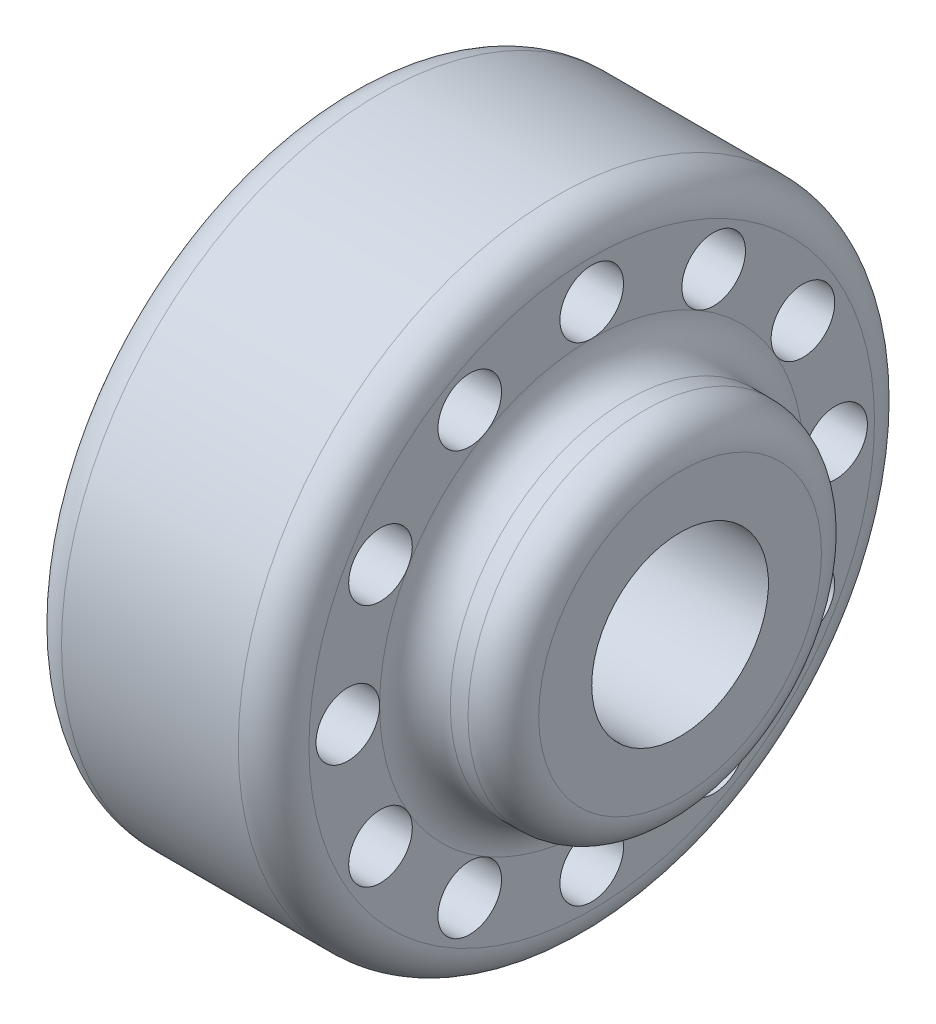
ISO-10303-21;
HEADER;
FILE_DESCRIPTION(('STEP AP214'),'2;1');
FILE_NAME('part.step','',(''),(''),'','','');
FILE_SCHEMA(('AUTOMOTIVE_DESIGN { 1 0 10303 214 1 1 1 1 }'));
ENDSEC;
DATA;
#1=APPLICATION_CONTEXT('core data for automotive mechanical design processes');
#2=APPLICATION_PROTOCOL_DEFINITION('international standard','automotive_design',2000,#1);
#3=PRODUCT_CONTEXT('',#1,'mechanical');
#4=PRODUCT('Part','Part','',(#3));
#5=PRODUCT_RELATED_PRODUCT_CATEGORY('part','',(#4));
#6=PRODUCT_DEFINITION_FORMATION('','',#4);
#7=PRODUCT_DEFINITION_CONTEXT('part definition',#1,'design');
#8=PRODUCT_DEFINITION('design','',#6,#7);
#9=PRODUCT_DEFINITION_SHAPE('','',#8);
#10=(LENGTH_UNIT() NAMED_UNIT(*) SI_UNIT(.MILLI.,.METRE.));
#11=(NAMED_UNIT(*) PLANE_ANGLE_UNIT() SI_UNIT($,.RADIAN.));
#12=(NAMED_UNIT(*) SI_UNIT($,.STERADIAN.) SOLID_ANGLE_UNIT());
#13=UNCERTAINTY_MEASURE_WITH_UNIT(LENGTH_MEASURE(1.E-05),#10,'distance_accuracy_value','');
#14=(GEOMETRIC_REPRESENTATION_CONTEXT(3) GLOBAL_UNCERTAINTY_ASSIGNED_CONTEXT((#13)) GLOBAL_UNIT_ASSIGNED_CONTEXT((#10,
#11,#12)) REPRESENTATION_CONTEXT('',''));
#15=CARTESIAN_POINT('',(0.,0.,0.));
#16=DIRECTION('',(0.,0.,1.));
#17=DIRECTION('',(1.,0.,0.));
#18=AXIS2_PLACEMENT_3D('',#15,#16,#17);
#19=CARTESIAN_POINT('',(30.,12.5,0.));
#20=DIRECTION('',(-1.,0.,0.));
#21=DIRECTION('',(0.,0.,1.));
#22=AXIS2_PLACEMENT_3D('',#19,#20,#21);
#23=PLANE('',#22);
#24=CARTESIAN_POINT('',(30.,0.,0.));
#25=DIRECTION('',(-1.,0.,0.));
#26=DIRECTION('',(0.,0.,1.));
#27=AXIS2_PLACEMENT_3D('',#24,#25,#26);
#28=CIRCLE('',#27,20.);
#29=CARTESIAN_POINT('',(30.,0.,20.));
#30=VERTEX_POINT('',#29);
#31=EDGE_CURVE('E141',#30,#30,#28,.T.);
#32=ORIENTED_EDGE('',*,*,#31,.F.);
#33=EDGE_LOOP('',(#32));
#34=FACE_BOUND('',#33,.T.);
#35=CARTESIAN_POINT('',(30.,0.,0.));
#36=DIRECTION('',(-1.,0.,0.));
#37=DIRECTION('',(0.,0.,1.));
#38=AXIS2_PLACEMENT_3D('',#35,#36,#37);
#39=CIRCLE('',#38,12.5);
#40=CARTESIAN_POINT('',(30.,0.,12.5));
#41=VERTEX_POINT('',#40);
#42=EDGE_CURVE('E11',#41,#41,#39,.T.);
#43=ORIENTED_EDGE('',*,*,#42,.T.);
#44=EDGE_LOOP('',(#43));
#45=FACE_BOUND('',#44,.T.);
#46=ADVANCED_FACE('F33',(#34,#45),#23,.F.);
#47=CARTESIAN_POINT('',(0.,0.,0.));
#48=DIRECTION('',(-1.,0.,0.));
#49=DIRECTION('',(0.,0.,1.));
#50=AXIS2_PLACEMENT_3D('',#47,#48,#49);
#51=CYLINDRICAL_SURFACE('',#50,12.5);
#52=ORIENTED_EDGE('',*,*,#42,.F.);
#53=EDGE_LOOP('',(#52));
#54=FACE_BOUND('',#53,.T.);
#55=CARTESIAN_POINT('',(-30.,0.,0.));
#56=DIRECTION('',(-1.,0.,0.));
#57=DIRECTION('',(0.,0.,1.));
#58=AXIS2_PLACEMENT_3D('',#55,#56,#57);
#59=CIRCLE('',#58,12.5);
#60=CARTESIAN_POINT('',(-30.,0.,12.5));
#61=VERTEX_POINT('',#60);
#62=EDGE_CURVE('E40',#61,#61,#59,.T.);
#63=ORIENTED_EDGE('',*,*,#62,.T.);
#64=EDGE_LOOP('',(#63));
#65=FACE_BOUND('',#64,.T.);
#66=ADVANCED_FACE('F183',(#54,#65),#51,.F.);
#67=CARTESIAN_POINT('',(-30.,12.5,0.));
#68=DIRECTION('',(1.,0.,0.));
#69=DIRECTION('',(0.,0.,-1.));
#70=AXIS2_PLACEMENT_3D('',#67,#68,#69);
#71=PLANE('',#70);
#72=ORIENTED_EDGE('',*,*,#62,.F.);
#73=EDGE_LOOP('',(#72));
#74=FACE_BOUND('',#73,.T.);
#75=CARTESIAN_POINT('',(-30.,0.,0.));
#76=DIRECTION('',(-1.,0.,0.));
#77=DIRECTION('',(0.,0.,1.));
#78=AXIS2_PLACEMENT_3D('',#75,#76,#77);
#79=CIRCLE('',#78,20.);
#80=CARTESIAN_POINT('',(-30.,0.,20.));
#81=VERTEX_POINT('',#80);
#82=EDGE_CURVE('E178',#81,#81,#79,.T.);
#83=ORIENTED_EDGE('',*,*,#82,.T.);
#84=EDGE_LOOP('',(#83));
#85=FACE_BOUND('',#84,.T.);
#86=ADVANCED_FACE('F185',(#74,#85),#71,.F.);
#87=CARTESIAN_POINT('',(-25.,0.,0.));
#88=DIRECTION('',(-1.,0.,0.));
#89=DIRECTION('',(0.,0.,1.));
#90=AXIS2_PLACEMENT_3D('',#87,#88,#89);
#91=TOROIDAL_SURFACE('',#90,20.,5.);
#92=ORIENTED_EDGE('',*,*,#82,.F.);
#93=EDGE_LOOP('',(#92));
#94=FACE_BOUND('',#93,.T.);
#95=CARTESIAN_POINT('',(-25.,0.,0.));
#96=DIRECTION('',(-1.,0.,0.));
#97=DIRECTION('',(0.,0.,1.));
#98=AXIS2_PLACEMENT_3D('',#95,#96,#97);
#99=CIRCLE('',#98,25.);
#100=CARTESIAN_POINT('',(-25.,0.,25.));
#101=VERTEX_POINT('',#100);
#102=EDGE_CURVE('E175',#101,#101,#99,.T.);
#103=ORIENTED_EDGE('',*,*,#102,.T.);
#104=EDGE_LOOP('',(#103));
#105=FACE_BOUND('',#104,.T.);
#106=ADVANCED_FACE('F188',(#94,#105),#91,.T.);
#107=CARTESIAN_POINT('',(0.,0.,0.));
#108=DIRECTION('',(-1.,0.,0.));
#109=DIRECTION('',(0.,0.,1.));
#110=AXIS2_PLACEMENT_3D('',#107,#108,#109);
#111=CYLINDRICAL_SURFACE('',#110,25.);
#112=ORIENTED_EDGE('',*,*,#102,.F.);
#113=EDGE_LOOP('',(#112));
#114=FACE_BOUND('',#113,.T.);
#115=CARTESIAN_POINT('',(-22.5,0.,0.));
#116=DIRECTION('',(-1.,0.,0.));
#117=DIRECTION('',(0.,0.,1.));
#118=AXIS2_PLACEMENT_3D('',#115,#116,#117);
#119=CIRCLE('',#118,25.);
#120=CARTESIAN_POINT('',(-22.5,0.,25.));
#121=VERTEX_POINT('',#120);
#122=EDGE_CURVE('E171',#121,#121,#119,.T.);
#123=ORIENTED_EDGE('',*,*,#122,.T.);
#124=EDGE_LOOP('',(#123));
#125=FACE_BOUND('',#124,.T.);
#126=ADVANCED_FACE('F194',(#114,#125),#111,.T.);
#127=CARTESIAN_POINT('',(-22.5,0.,0.));
#128=DIRECTION('',(-1.,0.,0.));
#129=DIRECTION('',(0.,0.,1.));
#130=AXIS2_PLACEMENT_3D('',#127,#128,#129);
#131=TOROIDAL_SURFACE('',#130,30.,5.);
#132=ORIENTED_EDGE('',*,*,#122,.F.);
#133=EDGE_LOOP('',(#132));
#134=FACE_BOUND('',#133,.T.);
#135=CARTESIAN_POINT('',(-17.5,0.,0.));
#136=DIRECTION('',(-1.,0.,0.));
#137=DIRECTION('',(0.,0.,1.));
#138=AXIS2_PLACEMENT_3D('',#135,#136,#137);
#139=CIRCLE('',#138,30.);
#140=CARTESIAN_POINT('',(-17.5,30.,0.));
#141=VERTEX_POINT('',#140);
#142=CARTESIAN_POINT('',(-17.5,25.9807621135331,-15.));
#143=VERTEX_POINT('',#142);
#144=EDGE_CURVE('E168',#141,#143,#139,.T.);
#145=ORIENTED_EDGE('',*,*,#144,.T.);
#146=CARTESIAN_POINT('',(-17.5,14.9999999999999,-25.9807621135332));
#147=VERTEX_POINT('',#146);
#148=EDGE_CURVE('E172',#143,#147,#139,.T.);
#149=ORIENTED_EDGE('',*,*,#148,.T.);
#150=CARTESIAN_POINT('',(-17.5,-1.04744440165294E-13,-30.));
#151=VERTEX_POINT('',#150);
#152=EDGE_CURVE('E547',#147,#151,#139,.T.);
#153=ORIENTED_EDGE('',*,*,#152,.T.);
#154=CARTESIAN_POINT('',(-17.5,-15.0000000000001,-25.9807621135331));
#155=VERTEX_POINT('',#154);
#156=EDGE_CURVE('E540',#151,#155,#139,.T.);
#157=ORIENTED_EDGE('',*,*,#156,.T.);
#158=CARTESIAN_POINT('',(-17.5,-25.9807621135332,-14.9999999999998));
#159=VERTEX_POINT('',#158);
#160=EDGE_CURVE('E543',#155,#159,#139,.T.);
#161=ORIENTED_EDGE('',*,*,#160,.T.);
#162=CARTESIAN_POINT('',(-17.5,-30.,0.));
#163=VERTEX_POINT('',#162);
#164=EDGE_CURVE('E546',#159,#163,#139,.T.);
#165=ORIENTED_EDGE('',*,*,#164,.T.);
#166=CARTESIAN_POINT('',(-17.5,-25.980762113533,15.0000000000002));
#167=VERTEX_POINT('',#166);
#168=EDGE_CURVE('E549',#163,#167,#139,.T.);
#169=ORIENTED_EDGE('',*,*,#168,.T.);
#170=CARTESIAN_POINT('',(-17.5,-14.9999999999998,25.9807621135333));
#171=VERTEX_POINT('',#170);
#172=EDGE_CURVE('E551',#167,#171,#139,.T.);
#173=ORIENTED_EDGE('',*,*,#172,.T.);
#174=CARTESIAN_POINT('',(-17.5,3.14233320495882E-13,30.));
#175=VERTEX_POINT('',#174);
#176=EDGE_CURVE('E554',#171,#175,#139,.T.);
#177=ORIENTED_EDGE('',*,*,#176,.T.);
#178=CARTESIAN_POINT('',(-17.5,15.0000000000003,25.980762113533));
#179=VERTEX_POINT('',#178);
#180=EDGE_CURVE('E557',#175,#179,#139,.T.);
#181=ORIENTED_EDGE('',*,*,#180,.T.);
#182=CARTESIAN_POINT('',(-17.5,25.9807621135334,14.9999999999997));
#183=VERTEX_POINT('',#182);
#184=EDGE_CURVE('E560',#179,#183,#139,.T.);
#185=ORIENTED_EDGE('',*,*,#184,.T.);
#186=EDGE_CURVE('E167',#183,#141,#139,.T.);
#187=ORIENTED_EDGE('',*,*,#186,.T.);
#188=EDGE_LOOP('',(#145,#149,#153,#157,#161,#165,#169,#173,#177,#181,#185,#187));
#189=FACE_BOUND('',#188,.T.);
#190=ADVANCED_FACE('F200',(#134,#189),#131,.F.);
#191=CARTESIAN_POINT('',(-17.5,30.,0.));
#192=DIRECTION('',(1.,0.,0.));
#193=DIRECTION('',(0.,0.,-1.));
#194=AXIS2_PLACEMENT_3D('',#191,#192,#193);
#195=PLANE('',#194);
#196=ORIENTED_EDGE('',*,*,#152,.F.);
#197=CARTESIAN_POINT('',(-17.5,17.2499999999999,-29.8778764305632));
#198=DIRECTION('',(1.,0.,0.));
#199=DIRECTION('',(0.,0.,-1.));
#200=AXIS2_PLACEMENT_3D('',#197,#198,#199);
#201=CIRCLE('',#200,4.5);
#202=EDGE_CURVE('E228',#147,#147,#201,.F.);
#203=ORIENTED_EDGE('',*,*,#202,.F.);
#204=ORIENTED_EDGE('',*,*,#148,.F.);
#205=CARTESIAN_POINT('',(-17.5,29.8778764305631,-17.25));
#206=DIRECTION('',(1.,0.,0.));
#207=DIRECTION('',(0.,0.,-1.));
#208=AXIS2_PLACEMENT_3D('',#205,#206,#207);
#209=CIRCLE('',#208,4.5);
#210=EDGE_CURVE('E138',#143,#143,#209,.F.);
#211=ORIENTED_EDGE('',*,*,#210,.F.);
#212=ORIENTED_EDGE('',*,*,#144,.F.);
#213=CARTESIAN_POINT('',(-17.5,34.5,0.));
#214=DIRECTION('',(1.,0.,0.));
#215=DIRECTION('',(0.,0.,-1.));
#216=AXIS2_PLACEMENT_3D('',#213,#214,#215);
#217=CIRCLE('',#216,4.5);
#218=EDGE_CURVE('E137',#141,#141,#217,.F.);
#219=ORIENTED_EDGE('',*,*,#218,.F.);
#220=ORIENTED_EDGE('',*,*,#186,.F.);
#221=CARTESIAN_POINT('',(-17.5,29.8778764305634,17.2499999999996));
#222=DIRECTION('',(1.,0.,0.));
#223=DIRECTION('',(0.,0.,-1.));
#224=AXIS2_PLACEMENT_3D('',#221,#222,#223);
#225=CIRCLE('',#224,4.5);
#226=EDGE_CURVE('E45',#183,#183,#225,.F.);
#227=ORIENTED_EDGE('',*,*,#226,.F.);
#228=ORIENTED_EDGE('',*,*,#184,.F.);
#229=CARTESIAN_POINT('',(-17.5,17.2500000000003,29.8778764305629));
#230=DIRECTION('',(1.,0.,0.));
#231=DIRECTION('',(0.,0.,-1.));
#232=AXIS2_PLACEMENT_3D('',#229,#230,#231);
#233=CIRCLE('',#232,4.5);
#234=EDGE_CURVE('E50',#179,#179,#233,.F.);
#235=ORIENTED_EDGE('',*,*,#234,.F.);
#236=ORIENTED_EDGE('',*,*,#180,.F.);
#237=CARTESIAN_POINT('',(-17.5,3.61368318570264E-13,34.5));
#238=DIRECTION('',(1.,0.,0.));
#239=DIRECTION('',(0.,0.,-1.));
#240=AXIS2_PLACEMENT_3D('',#237,#238,#239);
#241=CIRCLE('',#240,4.5);
#242=EDGE_CURVE('E232',#175,#175,#241,.F.);
#243=ORIENTED_EDGE('',*,*,#242,.F.);
#244=ORIENTED_EDGE('',*,*,#176,.F.);
#245=CARTESIAN_POINT('',(-17.5,-17.2499999999997,29.8778764305633));
#246=DIRECTION('',(1.,0.,0.));
#247=DIRECTION('',(0.,0.,-1.));
#248=AXIS2_PLACEMENT_3D('',#245,#246,#247);
#249=CIRCLE('',#248,4.5);
#250=EDGE_CURVE('E237',#171,#171,#249,.F.);
#251=ORIENTED_EDGE('',*,*,#250,.F.);
#252=ORIENTED_EDGE('',*,*,#172,.F.);
#253=CARTESIAN_POINT('',(-17.5,-29.877876430563,17.2500000000002));
#254=DIRECTION('',(1.,0.,0.));
#255=DIRECTION('',(0.,0.,-1.));
#256=AXIS2_PLACEMENT_3D('',#253,#254,#255);
#257=CIRCLE('',#256,4.5);
#258=EDGE_CURVE('E241',#167,#167,#257,.F.);
#259=ORIENTED_EDGE('',*,*,#258,.F.);
#260=ORIENTED_EDGE('',*,*,#168,.F.);
#261=CARTESIAN_POINT('',(-17.5,-34.5,0.));
#262=DIRECTION('',(1.,0.,0.));
#263=DIRECTION('',(0.,0.,-1.));
#264=AXIS2_PLACEMENT_3D('',#261,#262,#263);
#265=CIRCLE('',#264,4.5);
#266=EDGE_CURVE('E245',#163,#163,#265,.F.);
#267=ORIENTED_EDGE('',*,*,#266,.F.);
#268=ORIENTED_EDGE('',*,*,#164,.F.);
#269=CARTESIAN_POINT('',(-17.5,-29.8778764305632,-17.2499999999998));
#270=DIRECTION('',(1.,0.,0.));
#271=DIRECTION('',(0.,0.,-1.));
#272=AXIS2_PLACEMENT_3D('',#269,#270,#271);
#273=CIRCLE('',#272,4.5);
#274=EDGE_CURVE('E249',#159,#159,#273,.F.);
#275=ORIENTED_EDGE('',*,*,#274,.F.);
#276=ORIENTED_EDGE('',*,*,#160,.F.);
#277=CARTESIAN_POINT('',(-17.5,-17.2500000000001,-29.8778764305631));
#278=DIRECTION('',(1.,0.,0.));
#279=DIRECTION('',(0.,0.,-1.));
#280=AXIS2_PLACEMENT_3D('',#277,#278,#279);
#281=CIRCLE('',#280,4.5);
#282=EDGE_CURVE('E253',#155,#155,#281,.F.);
#283=ORIENTED_EDGE('',*,*,#282,.F.);
#284=ORIENTED_EDGE('',*,*,#156,.F.);
#285=CARTESIAN_POINT('',(-17.5,-1.20456106190088E-13,-34.5));
#286=DIRECTION('',(1.,0.,0.));
#287=DIRECTION('',(0.,0.,-1.));
#288=AXIS2_PLACEMENT_3D('',#285,#286,#287);
#289=CIRCLE('',#288,4.5);
#290=EDGE_CURVE('E257',#151,#151,#289,.F.);
#291=ORIENTED_EDGE('',*,*,#290,.F.);
#292=EDGE_LOOP('',(#196,#203,#204,#211,#212,#219,#220,#227,#228,#235,#236,#243,#244,#251,#252,
#259,#260,#267,#268,#275,#276,#283,#284,#291));
#293=FACE_BOUND('',#292,.T.);
#294=CARTESIAN_POINT('',(-17.5,0.,0.));
#295=DIRECTION('',(-1.,0.,0.));
#296=DIRECTION('',(0.,0.,1.));
#297=AXIS2_PLACEMENT_3D('',#294,#295,#296);
#298=CIRCLE('',#297,40.);
#299=CARTESIAN_POINT('',(-17.5,0.,40.));
#300=VERTEX_POINT('',#299);
#301=EDGE_CURVE('E164',#300,#300,#298,.T.);
#302=ORIENTED_EDGE('',*,*,#301,.T.);
#303=EDGE_LOOP('',(#302));
#304=FACE_BOUND('',#303,.T.);
#305=ADVANCED_FACE('F206',(#293,#304),#195,.F.);
#306=CARTESIAN_POINT('',(-12.5,0.,0.));
#307=DIRECTION('',(-1.,0.,0.));
#308=DIRECTION('',(0.,0.,1.));
#309=AXIS2_PLACEMENT_3D('',#306,#307,#308);
#310=TOROIDAL_SURFACE('',#309,40.,5.);
#311=ORIENTED_EDGE('',*,*,#301,.F.);
#312=EDGE_LOOP('',(#311));
#313=FACE_BOUND('',#312,.T.);
#314=CARTESIAN_POINT('',(-12.5,0.,0.));
#315=DIRECTION('',(-1.,0.,0.));
#316=DIRECTION('',(0.,0.,1.));
#317=AXIS2_PLACEMENT_3D('',#314,#315,#316);
#318=CIRCLE('',#317,45.);
#319=CARTESIAN_POINT('',(-12.5,0.,45.));
#320=VERTEX_POINT('',#319);
#321=EDGE_CURVE('E161',#320,#320,#318,.T.);
#322=ORIENTED_EDGE('',*,*,#321,.T.);
#323=EDGE_LOOP('',(#322));
#324=FACE_BOUND('',#323,.T.);
#325=ADVANCED_FACE('F352',(#313,#324),#310,.T.);
#326=CARTESIAN_POINT('',(0.,0.,0.));
#327=DIRECTION('',(-1.,0.,0.));
#328=DIRECTION('',(0.,0.,1.));
#329=AXIS2_PLACEMENT_3D('',#326,#327,#328);
#330=CYLINDRICAL_SURFACE('',#329,45.);
#331=ORIENTED_EDGE('',*,*,#321,.F.);
#332=EDGE_LOOP('',(#331));
#333=FACE_BOUND('',#332,.T.);
#334=CARTESIAN_POINT('',(12.5,0.,0.));
#335=DIRECTION('',(-1.,0.,0.));
#336=DIRECTION('',(0.,0.,1.));
#337=AXIS2_PLACEMENT_3D('',#334,#335,#336);
#338=CIRCLE('',#337,45.);
#339=CARTESIAN_POINT('',(12.5,0.,45.));
#340=VERTEX_POINT('',#339);
#341=EDGE_CURVE('E158',#340,#340,#338,.T.);
#342=ORIENTED_EDGE('',*,*,#341,.T.);
#343=EDGE_LOOP('',(#342));
#344=FACE_BOUND('',#343,.T.);
#345=ADVANCED_FACE('F348',(#333,#344),#330,.T.);
#346=CARTESIAN_POINT('',(12.5,0.,0.));
#347=DIRECTION('',(-1.,0.,0.));
#348=DIRECTION('',(0.,0.,1.));
#349=AXIS2_PLACEMENT_3D('',#346,#347,#348);
#350=TOROIDAL_SURFACE('',#349,40.,5.);
#351=ORIENTED_EDGE('',*,*,#341,.F.);
#352=EDGE_LOOP('',(#351));
#353=FACE_BOUND('',#352,.T.);
#354=CARTESIAN_POINT('',(17.5,0.,0.));
#355=DIRECTION('',(-1.,0.,0.));
#356=DIRECTION('',(0.,0.,1.));
#357=AXIS2_PLACEMENT_3D('',#354,#355,#356);
#358=CIRCLE('',#357,40.);
#359=CARTESIAN_POINT('',(17.5,0.,40.));
#360=VERTEX_POINT('',#359);
#361=EDGE_CURVE('E154',#360,#360,#358,.T.);
#362=ORIENTED_EDGE('',*,*,#361,.T.);
#363=EDGE_LOOP('',(#362));
#364=FACE_BOUND('',#363,.T.);
#365=ADVANCED_FACE('F344',(#353,#364),#350,.T.);
#366=CARTESIAN_POINT('',(17.5,30.,0.));
#367=DIRECTION('',(-1.,0.,0.));
#368=DIRECTION('',(0.,0.,1.));
#369=AXIS2_PLACEMENT_3D('',#366,#367,#368);
#370=PLANE('',#369);
#371=ORIENTED_EDGE('',*,*,#361,.F.);
#372=EDGE_LOOP('',(#371));
#373=FACE_BOUND('',#372,.T.);
#374=CARTESIAN_POINT('',(17.5,0.,0.));
#375=DIRECTION('',(-1.,0.,0.));
#376=DIRECTION('',(0.,0.,1.));
#377=AXIS2_PLACEMENT_3D('',#374,#375,#376);
#378=CIRCLE('',#377,30.);
#379=CARTESIAN_POINT('',(17.5,25.9807621135331,-15.));
#380=VERTEX_POINT('',#379);
#381=CARTESIAN_POINT('',(17.5,14.9999999999999,-25.9807621135332));
#382=VERTEX_POINT('',#381);
#383=EDGE_CURVE('E155',#380,#382,#378,.T.);
#384=ORIENTED_EDGE('',*,*,#383,.T.);
#385=CARTESIAN_POINT('',(17.5,17.2499999999999,-29.8778764305632));
#386=DIRECTION('',(1.,0.,0.));
#387=DIRECTION('',(0.,-0.86602540378444,-0.499999999999998));
#388=AXIS2_PLACEMENT_3D('',#385,#386,#387);
#389=CIRCLE('',#388,4.5);
#390=EDGE_CURVE('E229',#382,#382,#389,.T.);
#391=ORIENTED_EDGE('',*,*,#390,.F.);
#392=CARTESIAN_POINT('',(17.5,-1.04744440165294E-13,-30.));
#393=VERTEX_POINT('',#392);
#394=EDGE_CURVE('E296',#382,#393,#378,.T.);
#395=ORIENTED_EDGE('',*,*,#394,.T.);
#396=CARTESIAN_POINT('',(17.5,-1.20456106190088E-13,-34.5));
#397=DIRECTION('',(1.,0.,0.));
#398=DIRECTION('',(0.,-1.,0.));
#399=AXIS2_PLACEMENT_3D('',#396,#397,#398);
#400=CIRCLE('',#399,4.5);
#401=EDGE_CURVE('E255',#393,#393,#400,.T.);
#402=ORIENTED_EDGE('',*,*,#401,.F.);
#403=CARTESIAN_POINT('',(17.5,-15.0000000000001,-25.9807621135331));
#404=VERTEX_POINT('',#403);
#405=EDGE_CURVE('E292',#393,#404,#378,.T.);
#406=ORIENTED_EDGE('',*,*,#405,.T.);
#407=CARTESIAN_POINT('',(17.5,-17.2500000000001,-29.8778764305631));
#408=DIRECTION('',(1.,0.,0.));
#409=DIRECTION('',(0.,-0.866025403784436,0.500000000000004));
#410=AXIS2_PLACEMENT_3D('',#407,#408,#409);
#411=CIRCLE('',#410,4.5);
#412=EDGE_CURVE('E251',#404,#404,#411,.T.);
#413=ORIENTED_EDGE('',*,*,#412,.F.);
#414=CARTESIAN_POINT('',(17.5,-25.9807621135332,-14.9999999999998));
#415=VERTEX_POINT('',#414);
#416=EDGE_CURVE('E288',#404,#415,#378,.T.);
#417=ORIENTED_EDGE('',*,*,#416,.T.);
#418=CARTESIAN_POINT('',(17.5,-29.8778764305632,-17.2499999999998));
#419=DIRECTION('',(1.,0.,0.));
#420=DIRECTION('',(0.,-0.499999999999995,0.866025403784442));
#421=AXIS2_PLACEMENT_3D('',#418,#419,#420);
#422=CIRCLE('',#421,4.5);
#423=EDGE_CURVE('E247',#415,#415,#422,.T.);
#424=ORIENTED_EDGE('',*,*,#423,.F.);
#425=CARTESIAN_POINT('',(17.5,-30.,0.));
#426=VERTEX_POINT('',#425);
#427=EDGE_CURVE('E284',#415,#426,#378,.T.);
#428=ORIENTED_EDGE('',*,*,#427,.T.);
#429=CARTESIAN_POINT('',(17.5,-34.5,0.));
#430=DIRECTION('',(1.,0.,0.));
#431=DIRECTION('',(0.,0.,1.));
#432=AXIS2_PLACEMENT_3D('',#429,#430,#431);
#433=CIRCLE('',#432,4.5);
#434=EDGE_CURVE('E243',#426,#426,#433,.T.);
#435=ORIENTED_EDGE('',*,*,#434,.F.);
#436=CARTESIAN_POINT('',(17.5,-25.980762113533,15.0000000000002));
#437=VERTEX_POINT('',#436);
#438=EDGE_CURVE('E280',#426,#437,#378,.T.);
#439=ORIENTED_EDGE('',*,*,#438,.T.);
#440=CARTESIAN_POINT('',(17.5,-29.877876430563,17.2500000000002));
#441=DIRECTION('',(1.,0.,0.));
#442=DIRECTION('',(0.,0.500000000000007,0.866025403784435));
#443=AXIS2_PLACEMENT_3D('',#440,#441,#442);
#444=CIRCLE('',#443,4.5);
#445=EDGE_CURVE('E239',#437,#437,#444,.T.);
#446=ORIENTED_EDGE('',*,*,#445,.F.);
#447=CARTESIAN_POINT('',(17.5,-14.9999999999998,25.9807621135333));
#448=VERTEX_POINT('',#447);
#449=EDGE_CURVE('E277',#437,#448,#378,.T.);
#450=ORIENTED_EDGE('',*,*,#449,.T.);
#451=CARTESIAN_POINT('',(17.5,-17.2499999999997,29.8778764305633));
#452=DIRECTION('',(1.,0.,0.));
#453=DIRECTION('',(0.,0.866025403784443,0.499999999999992));
#454=AXIS2_PLACEMENT_3D('',#451,#452,#453);
#455=CIRCLE('',#454,4.5);
#456=EDGE_CURVE('E234',#448,#448,#455,.T.);
#457=ORIENTED_EDGE('',*,*,#456,.F.);
#458=CARTESIAN_POINT('',(17.5,3.14233320495882E-13,30.));
#459=VERTEX_POINT('',#458);
#460=EDGE_CURVE('E276',#448,#459,#378,.T.);
#461=ORIENTED_EDGE('',*,*,#460,.T.);
#462=CARTESIAN_POINT('',(17.5,3.61368318570264E-13,34.5));
#463=DIRECTION('',(1.,0.,0.));
#464=DIRECTION('',(0.,1.,0.));
#465=AXIS2_PLACEMENT_3D('',#462,#463,#464);
#466=CIRCLE('',#465,4.5);
#467=EDGE_CURVE('E235',#459,#459,#466,.T.);
#468=ORIENTED_EDGE('',*,*,#467,.F.);
#469=CARTESIAN_POINT('',(17.5,15.0000000000003,25.980762113533));
#470=VERTEX_POINT('',#469);
#471=EDGE_CURVE('E271',#459,#470,#378,.T.);
#472=ORIENTED_EDGE('',*,*,#471,.T.);
#473=CARTESIAN_POINT('',(17.5,17.2500000000003,29.8778764305629));
#474=DIRECTION('',(1.,0.,0.));
#475=DIRECTION('',(0.,0.866025403784433,-0.50000000000001));
#476=AXIS2_PLACEMENT_3D('',#473,#474,#475);
#477=CIRCLE('',#476,4.5);
#478=EDGE_CURVE('E262',#470,#470,#477,.T.);
#479=ORIENTED_EDGE('',*,*,#478,.F.);
#480=CARTESIAN_POINT('',(17.5,25.9807621135334,14.9999999999997));
#481=VERTEX_POINT('',#480);
#482=EDGE_CURVE('E131',#470,#481,#378,.T.);
#483=ORIENTED_EDGE('',*,*,#482,.T.);
#484=CARTESIAN_POINT('',(17.5,29.8778764305634,17.2499999999996));
#485=DIRECTION('',(1.,0.,0.));
#486=DIRECTION('',(0.,0.499999999999989,-0.866025403784445));
#487=AXIS2_PLACEMENT_3D('',#484,#485,#486);
#488=CIRCLE('',#487,4.5);
#489=EDGE_CURVE('E128',#481,#481,#488,.T.);
#490=ORIENTED_EDGE('',*,*,#489,.F.);
#491=CARTESIAN_POINT('',(17.5,30.,0.));
#492=VERTEX_POINT('',#491);
#493=EDGE_CURVE('E120',#481,#492,#378,.T.);
#494=ORIENTED_EDGE('',*,*,#493,.T.);
#495=CARTESIAN_POINT('',(17.5,34.5,0.));
#496=DIRECTION('',(1.,0.,0.));
#497=DIRECTION('',(0.,0.,-1.));
#498=AXIS2_PLACEMENT_3D('',#495,#496,#497);
#499=CIRCLE('',#498,4.5);
#500=EDGE_CURVE('E125',#492,#492,#499,.T.);
#501=ORIENTED_EDGE('',*,*,#500,.F.);
#502=EDGE_CURVE('E134',#492,#380,#378,.T.);
#503=ORIENTED_EDGE('',*,*,#502,.T.);
#504=CARTESIAN_POINT('',(17.5,29.8778764305631,-17.25));
#505=DIRECTION('',(1.,0.,0.));
#506=DIRECTION('',(0.,-0.500000000000001,-0.866025403784438));
#507=AXIS2_PLACEMENT_3D('',#504,#505,#506);
#508=CIRCLE('',#507,4.5);
#509=EDGE_CURVE('E143',#380,#380,#508,.T.);
#510=ORIENTED_EDGE('',*,*,#509,.F.);
#511=EDGE_LOOP('',(#384,#391,#395,#402,#406,#413,#417,#424,#428,#435,#439,#446,#450,#457,#461,
#468,#472,#479,#483,#490,#494,#501,#503,#510));
#512=FACE_BOUND('',#511,.T.);
#513=ADVANCED_FACE('F123',(#373,#512),#370,.F.);
#514=CARTESIAN_POINT('',(22.5,0.,0.));
#515=DIRECTION('',(-1.,0.,0.));
#516=DIRECTION('',(0.,0.,1.));
#517=AXIS2_PLACEMENT_3D('',#514,#515,#516);
#518=TOROIDAL_SURFACE('',#517,30.,5.);
#519=ORIENTED_EDGE('',*,*,#502,.F.);
#520=ORIENTED_EDGE('',*,*,#493,.F.);
#521=ORIENTED_EDGE('',*,*,#482,.F.);
#522=ORIENTED_EDGE('',*,*,#471,.F.);
#523=ORIENTED_EDGE('',*,*,#460,.F.);
#524=ORIENTED_EDGE('',*,*,#449,.F.);
#525=ORIENTED_EDGE('',*,*,#438,.F.);
#526=ORIENTED_EDGE('',*,*,#427,.F.);
#527=ORIENTED_EDGE('',*,*,#416,.F.);
#528=ORIENTED_EDGE('',*,*,#405,.F.);
#529=ORIENTED_EDGE('',*,*,#394,.F.);
#530=ORIENTED_EDGE('',*,*,#383,.F.);
#531=EDGE_LOOP('',(#519,#520,#521,#522,#523,#524,#525,#526,#527,#528,#529,#530));
#532=FACE_BOUND('',#531,.T.);
#533=CARTESIAN_POINT('',(22.5,0.,0.));
#534=DIRECTION('',(-1.,0.,0.));
#535=DIRECTION('',(0.,0.,1.));
#536=AXIS2_PLACEMENT_3D('',#533,#534,#535);
#537=CIRCLE('',#536,25.);
#538=CARTESIAN_POINT('',(22.5,0.,25.));
#539=VERTEX_POINT('',#538);
#540=EDGE_CURVE('E132',#539,#539,#537,.T.);
#541=ORIENTED_EDGE('',*,*,#540,.T.);
#542=EDGE_LOOP('',(#541));
#543=FACE_BOUND('',#542,.T.);
#544=ADVANCED_FACE('F272',(#532,#543),#518,.F.);
#545=CARTESIAN_POINT('',(0.,0.,0.));
#546=DIRECTION('',(-1.,0.,0.));
#547=DIRECTION('',(0.,0.,1.));
#548=AXIS2_PLACEMENT_3D('',#545,#546,#547);
#549=CYLINDRICAL_SURFACE('',#548,25.);
#550=ORIENTED_EDGE('',*,*,#540,.F.);
#551=EDGE_LOOP('',(#550));
#552=FACE_BOUND('',#551,.T.);
#553=CARTESIAN_POINT('',(25.,0.,0.));
#554=DIRECTION('',(-1.,0.,0.));
#555=DIRECTION('',(0.,0.,1.));
#556=AXIS2_PLACEMENT_3D('',#553,#554,#555);
#557=CIRCLE('',#556,25.);
#558=CARTESIAN_POINT('',(25.,0.,25.));
#559=VERTEX_POINT('',#558);
#560=EDGE_CURVE('E149',#559,#559,#557,.T.);
#561=ORIENTED_EDGE('',*,*,#560,.T.);
#562=EDGE_LOOP('',(#561));
#563=FACE_BOUND('',#562,.T.);
#564=ADVANCED_FACE('F327',(#552,#563),#549,.T.);
#565=CARTESIAN_POINT('',(25.,0.,0.));
#566=DIRECTION('',(-1.,0.,0.));
#567=DIRECTION('',(0.,0.,1.));
#568=AXIS2_PLACEMENT_3D('',#565,#566,#567);
#569=TOROIDAL_SURFACE('',#568,20.,5.);
#570=ORIENTED_EDGE('',*,*,#560,.F.);
#571=EDGE_LOOP('',(#570));
#572=FACE_BOUND('',#571,.T.);
#573=ORIENTED_EDGE('',*,*,#31,.T.);
#574=EDGE_LOOP('',(#573));
#575=FACE_BOUND('',#574,.T.);
#576=ADVANCED_FACE('F325',(#572,#575),#569,.T.);
#577=CARTESIAN_POINT('',(-30.2279220613579,34.5,0.));
#578=DIRECTION('',(1.,0.,0.));
#579=DIRECTION('',(0.,0.,-1.));
#580=AXIS2_PLACEMENT_3D('',#577,#578,#579);
#581=CYLINDRICAL_SURFACE('',#580,4.5);
#582=ORIENTED_EDGE('',*,*,#218,.T.);
#583=EDGE_LOOP('',(#582));
#584=FACE_BOUND('',#583,.T.);
#585=ORIENTED_EDGE('',*,*,#500,.T.);
#586=EDGE_LOOP('',(#585));
#587=FACE_BOUND('',#586,.T.);
#588=ADVANCED_FACE('F136',(#584,#587),#581,.F.);
#589=CARTESIAN_POINT('',(-30.2279220613579,29.8778764305631,-17.25));
#590=DIRECTION('',(1.,0.,0.));
#591=DIRECTION('',(0.,0.,-1.));
#592=AXIS2_PLACEMENT_3D('',#589,#590,#591);
#593=CYLINDRICAL_SURFACE('',#592,4.5);
#594=ORIENTED_EDGE('',*,*,#210,.T.);
#595=EDGE_LOOP('',(#594));
#596=FACE_BOUND('',#595,.T.);
#597=ORIENTED_EDGE('',*,*,#509,.T.);
#598=EDGE_LOOP('',(#597));
#599=FACE_BOUND('',#598,.T.);
#600=ADVANCED_FACE('F221',(#596,#599),#593,.F.);
#601=CARTESIAN_POINT('',(-30.2279220613579,29.8778764305634,17.2499999999996));
#602=DIRECTION('',(1.,0.,0.));
#603=DIRECTION('',(0.,0.,-1.));
#604=AXIS2_PLACEMENT_3D('',#601,#602,#603);
#605=CYLINDRICAL_SURFACE('',#604,4.5);
#606=ORIENTED_EDGE('',*,*,#226,.T.);
#607=EDGE_LOOP('',(#606));
#608=FACE_BOUND('',#607,.T.);
#609=ORIENTED_EDGE('',*,*,#489,.T.);
#610=EDGE_LOOP('',(#609));
#611=FACE_BOUND('',#610,.T.);
#612=ADVANCED_FACE('F224',(#608,#611),#605,.F.);
#613=CARTESIAN_POINT('',(-30.2279220613579,17.2500000000003,29.8778764305629));
#614=DIRECTION('',(1.,0.,0.));
#615=DIRECTION('',(0.,0.,-1.));
#616=AXIS2_PLACEMENT_3D('',#613,#614,#615);
#617=CYLINDRICAL_SURFACE('',#616,4.5);
#618=ORIENTED_EDGE('',*,*,#234,.T.);
#619=EDGE_LOOP('',(#618));
#620=FACE_BOUND('',#619,.T.);
#621=ORIENTED_EDGE('',*,*,#478,.T.);
#622=EDGE_LOOP('',(#621));
#623=FACE_BOUND('',#622,.T.);
#624=ADVANCED_FACE('F267',(#620,#623),#617,.F.);
#625=CARTESIAN_POINT('',(-30.2279220613579,3.61368318570264E-13,34.5));
#626=DIRECTION('',(1.,0.,0.));
#627=DIRECTION('',(0.,0.,-1.));
#628=AXIS2_PLACEMENT_3D('',#625,#626,#627);
#629=CYLINDRICAL_SURFACE('',#628,4.5);
#630=ORIENTED_EDGE('',*,*,#242,.T.);
#631=EDGE_LOOP('',(#630));
#632=FACE_BOUND('',#631,.T.);
#633=ORIENTED_EDGE('',*,*,#467,.T.);
#634=EDGE_LOOP('',(#633));
#635=FACE_BOUND('',#634,.T.);
#636=ADVANCED_FACE('F457',(#632,#635),#629,.F.);
#637=CARTESIAN_POINT('',(-30.2279220613579,-17.2499999999997,29.8778764305633));
#638=DIRECTION('',(1.,0.,0.));
#639=DIRECTION('',(0.,0.,-1.));
#640=AXIS2_PLACEMENT_3D('',#637,#638,#639);
#641=CYLINDRICAL_SURFACE('',#640,4.5);
#642=ORIENTED_EDGE('',*,*,#250,.T.);
#643=EDGE_LOOP('',(#642));
#644=FACE_BOUND('',#643,.T.);
#645=ORIENTED_EDGE('',*,*,#456,.T.);
#646=EDGE_LOOP('',(#645));
#647=FACE_BOUND('',#646,.T.);
#648=ADVANCED_FACE('F464',(#644,#647),#641,.F.);
#649=CARTESIAN_POINT('',(-30.2279220613579,-29.877876430563,17.2500000000002));
#650=DIRECTION('',(1.,0.,0.));
#651=DIRECTION('',(0.,0.,-1.));
#652=AXIS2_PLACEMENT_3D('',#649,#650,#651);
#653=CYLINDRICAL_SURFACE('',#652,4.5);
#654=ORIENTED_EDGE('',*,*,#258,.T.);
#655=EDGE_LOOP('',(#654));
#656=FACE_BOUND('',#655,.T.);
#657=ORIENTED_EDGE('',*,*,#445,.T.);
#658=EDGE_LOOP('',(#657));
#659=FACE_BOUND('',#658,.T.);
#660=ADVANCED_FACE('F472',(#656,#659),#653,.F.);
#661=CARTESIAN_POINT('',(-30.2279220613579,-34.5,0.));
#662=DIRECTION('',(1.,0.,0.));
#663=DIRECTION('',(0.,0.,-1.));
#664=AXIS2_PLACEMENT_3D('',#661,#662,#663);
#665=CYLINDRICAL_SURFACE('',#664,4.5);
#666=ORIENTED_EDGE('',*,*,#266,.T.);
#667=EDGE_LOOP('',(#666));
#668=FACE_BOUND('',#667,.T.);
#669=ORIENTED_EDGE('',*,*,#434,.T.);
#670=EDGE_LOOP('',(#669));
#671=FACE_BOUND('',#670,.T.);
#672=ADVANCED_FACE('F480',(#668,#671),#665,.F.);
#673=CARTESIAN_POINT('',(-30.2279220613579,-29.8778764305632,-17.2499999999998));
#674=DIRECTION('',(1.,0.,0.));
#675=DIRECTION('',(0.,0.,-1.));
#676=AXIS2_PLACEMENT_3D('',#673,#674,#675);
#677=CYLINDRICAL_SURFACE('',#676,4.5);
#678=ORIENTED_EDGE('',*,*,#274,.T.);
#679=EDGE_LOOP('',(#678));
#680=FACE_BOUND('',#679,.T.);
#681=ORIENTED_EDGE('',*,*,#423,.T.);
#682=EDGE_LOOP('',(#681));
#683=FACE_BOUND('',#682,.T.);
#684=ADVANCED_FACE('F488',(#680,#683),#677,.F.);
#685=CARTESIAN_POINT('',(-30.2279220613579,-17.2500000000001,-29.8778764305631));
#686=DIRECTION('',(1.,0.,0.));
#687=DIRECTION('',(0.,0.,-1.));
#688=AXIS2_PLACEMENT_3D('',#685,#686,#687);
#689=CYLINDRICAL_SURFACE('',#688,4.5);
#690=ORIENTED_EDGE('',*,*,#282,.T.);
#691=EDGE_LOOP('',(#690));
#692=FACE_BOUND('',#691,.T.);
#693=ORIENTED_EDGE('',*,*,#412,.T.);
#694=EDGE_LOOP('',(#693));
#695=FACE_BOUND('',#694,.T.);
#696=ADVANCED_FACE('F311',(#692,#695),#689,.F.);
#697=CARTESIAN_POINT('',(-30.2279220613579,-1.20456106190088E-13,-34.5));
#698=DIRECTION('',(1.,0.,0.));
#699=DIRECTION('',(0.,0.,-1.));
#700=AXIS2_PLACEMENT_3D('',#697,#698,#699);
#701=CYLINDRICAL_SURFACE('',#700,4.5);
#702=ORIENTED_EDGE('',*,*,#290,.T.);
#703=EDGE_LOOP('',(#702));
#704=FACE_BOUND('',#703,.T.);
#705=ORIENTED_EDGE('',*,*,#401,.T.);
#706=EDGE_LOOP('',(#705));
#707=FACE_BOUND('',#706,.T.);
#708=ADVANCED_FACE('F305',(#704,#707),#701,.F.);
#709=CARTESIAN_POINT('',(-30.2279220613579,17.2499999999999,-29.8778764305632));
#710=DIRECTION('',(1.,0.,0.));
#711=DIRECTION('',(0.,0.,-1.));
#712=AXIS2_PLACEMENT_3D('',#709,#710,#711);
#713=CYLINDRICAL_SURFACE('',#712,4.5);
#714=ORIENTED_EDGE('',*,*,#202,.T.);
#715=EDGE_LOOP('',(#714));
#716=FACE_BOUND('',#715,.T.);
#717=ORIENTED_EDGE('',*,*,#390,.T.);
#718=EDGE_LOOP('',(#717));
#719=FACE_BOUND('',#718,.T.);
#720=ADVANCED_FACE('F303',(#716,#719),#713,.F.);
#721=CLOSED_SHELL('',(#46,#66,#86,#106,#126,#190,#305,#325,#345,#365,#513,#544,#564,#576,#588,
#600,#612,#624,#636,#648,#660,#672,#684,#696,#708,#720));
#722=MANIFOLD_SOLID_BREP('B2',#721);
#723=ADVANCED_BREP_SHAPE_REPRESENTATION('',(#18,#722),#14);
#724=SHAPE_DEFINITION_REPRESENTATION(#9,#723);
ENDSEC;
END-ISO-10303-21;
